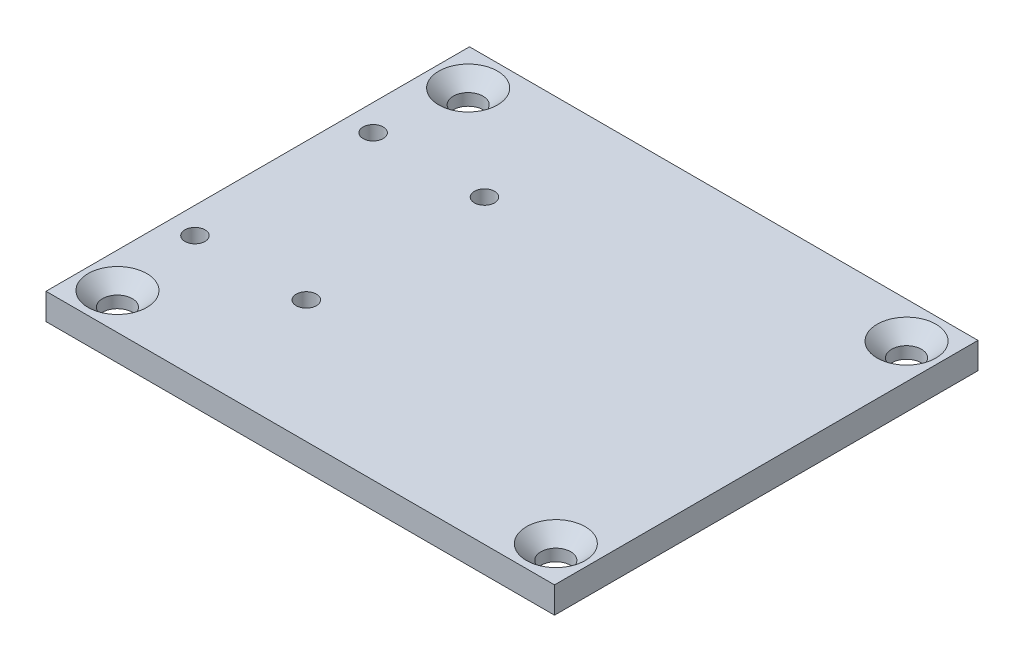
ISO-10303-21;
HEADER;
FILE_DESCRIPTION(('STEP AP214'),'2;1');
FILE_NAME('part.step','',(''),(''),'','','');
FILE_SCHEMA(('AUTOMOTIVE_DESIGN { 1 0 10303 214 1 1 1 1 }'));
ENDSEC;
DATA;
#1=APPLICATION_CONTEXT('core data for automotive mechanical design processes');
#2=APPLICATION_PROTOCOL_DEFINITION('international standard','automotive_design',2000,#1);
#3=PRODUCT_CONTEXT('',#1,'mechanical');
#4=PRODUCT('Part','Part','',(#3));
#5=PRODUCT_RELATED_PRODUCT_CATEGORY('part','',(#4));
#6=PRODUCT_DEFINITION_FORMATION('','',#4);
#7=PRODUCT_DEFINITION_CONTEXT('part definition',#1,'design');
#8=PRODUCT_DEFINITION('design','',#6,#7);
#9=PRODUCT_DEFINITION_SHAPE('','',#8);
#10=(LENGTH_UNIT() NAMED_UNIT(*) SI_UNIT(.MILLI.,.METRE.));
#11=(NAMED_UNIT(*) PLANE_ANGLE_UNIT() SI_UNIT($,.RADIAN.));
#12=(NAMED_UNIT(*) SI_UNIT($,.STERADIAN.) SOLID_ANGLE_UNIT());
#13=UNCERTAINTY_MEASURE_WITH_UNIT(LENGTH_MEASURE(1.E-05),#10,'distance_accuracy_value','');
#14=(GEOMETRIC_REPRESENTATION_CONTEXT(3) GLOBAL_UNCERTAINTY_ASSIGNED_CONTEXT((#13)) GLOBAL_UNIT_ASSIGNED_CONTEXT((#10,
#11,#12)) REPRESENTATION_CONTEXT('',''));
#15=CARTESIAN_POINT('',(0.,0.,0.));
#16=DIRECTION('',(0.,0.,1.));
#17=DIRECTION('',(1.,0.,0.));
#18=AXIS2_PLACEMENT_3D('',#15,#16,#17);
#19=CARTESIAN_POINT('',(-29.,3.,-24.15));
#20=DIRECTION('',(0.,0.,-1.));
#21=DIRECTION('',(-1.,0.,0.));
#22=AXIS2_PLACEMENT_3D('',#19,#20,#21);
#23=PLANE('',#22);
#24=DIRECTION('',(1.,0.,0.));
#25=VECTOR('',#24,1.);
#26=CARTESIAN_POINT('',(-29.,0.,-24.15));
#27=LINE('',#26,#25);
#28=CARTESIAN_POINT('',(-29.,0.,-24.15));
#29=VERTEX_POINT('',#28);
#30=CARTESIAN_POINT('',(29.,0.,-24.15));
#31=VERTEX_POINT('',#30);
#32=EDGE_CURVE('E119',#29,#31,#27,.T.);
#33=ORIENTED_EDGE('',*,*,#32,.F.);
#34=DIRECTION('',(0.,-1.,0.));
#35=VECTOR('',#34,1.);
#36=CARTESIAN_POINT('',(-29.,3.,-24.15));
#37=LINE('',#36,#35);
#38=CARTESIAN_POINT('',(-29.,3.,-24.15));
#39=VERTEX_POINT('',#38);
#40=EDGE_CURVE('E11',#39,#29,#37,.T.);
#41=ORIENTED_EDGE('',*,*,#40,.F.);
#42=DIRECTION('',(1.,0.,0.));
#43=VECTOR('',#42,1.);
#44=CARTESIAN_POINT('',(-29.,3.,-24.15));
#45=LINE('',#44,#43);
#46=CARTESIAN_POINT('',(29.,3.,-24.15));
#47=VERTEX_POINT('',#46);
#48=EDGE_CURVE('E112',#39,#47,#45,.T.);
#49=ORIENTED_EDGE('',*,*,#48,.T.);
#50=DIRECTION('',(0.,-1.,0.));
#51=VECTOR('',#50,1.);
#52=CARTESIAN_POINT('',(29.,3.,-24.15));
#53=LINE('',#52,#51);
#54=EDGE_CURVE('E110',#47,#31,#53,.T.);
#55=ORIENTED_EDGE('',*,*,#54,.T.);
#56=EDGE_LOOP('',(#33,#41,#49,#55));
#57=FACE_BOUND('',#56,.T.);
#58=ADVANCED_FACE('F50',(#57),#23,.T.);
#59=CARTESIAN_POINT('',(-29.,3.,24.15));
#60=DIRECTION('',(-1.,0.,0.));
#61=DIRECTION('',(0.,0.,1.));
#62=AXIS2_PLACEMENT_3D('',#59,#60,#61);
#63=PLANE('',#62);
#64=DIRECTION('',(0.,0.,-1.));
#65=VECTOR('',#64,1.);
#66=CARTESIAN_POINT('',(-29.,0.,24.15));
#67=LINE('',#66,#65);
#68=CARTESIAN_POINT('',(-29.,0.,24.15));
#69=VERTEX_POINT('',#68);
#70=EDGE_CURVE('E111',#69,#29,#67,.T.);
#71=ORIENTED_EDGE('',*,*,#70,.F.);
#72=DIRECTION('',(0.,-1.,0.));
#73=VECTOR('',#72,1.);
#74=CARTESIAN_POINT('',(-29.,3.,24.15));
#75=LINE('',#74,#73);
#76=CARTESIAN_POINT('',(-29.,3.,24.15));
#77=VERTEX_POINT('',#76);
#78=EDGE_CURVE('E60',#77,#69,#75,.T.);
#79=ORIENTED_EDGE('',*,*,#78,.F.);
#80=DIRECTION('',(0.,0.,-1.));
#81=VECTOR('',#80,1.);
#82=CARTESIAN_POINT('',(-29.,3.,24.15));
#83=LINE('',#82,#81);
#84=EDGE_CURVE('E96',#77,#39,#83,.T.);
#85=ORIENTED_EDGE('',*,*,#84,.T.);
#86=ORIENTED_EDGE('',*,*,#40,.T.);
#87=EDGE_LOOP('',(#71,#79,#85,#86));
#88=FACE_BOUND('',#87,.T.);
#89=ADVANCED_FACE('F233',(#88),#63,.T.);
#90=CARTESIAN_POINT('',(-29.,3.,24.15));
#91=DIRECTION('',(0.,0.,-1.));
#92=DIRECTION('',(-1.,0.,0.));
#93=AXIS2_PLACEMENT_3D('',#90,#91,#92);
#94=PLANE('',#93);
#95=DIRECTION('',(1.,0.,0.));
#96=VECTOR('',#95,1.);
#97=CARTESIAN_POINT('',(-29.,0.,24.15));
#98=LINE('',#97,#96);
#99=CARTESIAN_POINT('',(29.,0.,24.15));
#100=VERTEX_POINT('',#99);
#101=EDGE_CURVE('E105',#69,#100,#98,.T.);
#102=ORIENTED_EDGE('',*,*,#101,.T.);
#103=DIRECTION('',(0.,-1.,0.));
#104=VECTOR('',#103,1.);
#105=CARTESIAN_POINT('',(29.,3.,24.15));
#106=LINE('',#105,#104);
#107=CARTESIAN_POINT('',(29.,3.,24.15));
#108=VERTEX_POINT('',#107);
#109=EDGE_CURVE('E99',#108,#100,#106,.T.);
#110=ORIENTED_EDGE('',*,*,#109,.F.);
#111=DIRECTION('',(1.,0.,0.));
#112=VECTOR('',#111,1.);
#113=CARTESIAN_POINT('',(-29.,3.,24.15));
#114=LINE('',#113,#112);
#115=EDGE_CURVE('E91',#77,#108,#114,.T.);
#116=ORIENTED_EDGE('',*,*,#115,.F.);
#117=ORIENTED_EDGE('',*,*,#78,.T.);
#118=EDGE_LOOP('',(#102,#110,#116,#117));
#119=FACE_BOUND('',#118,.T.);
#120=ADVANCED_FACE('F101',(#119),#94,.F.);
#121=CARTESIAN_POINT('',(29.,3.,24.15));
#122=DIRECTION('',(-1.,0.,0.));
#123=DIRECTION('',(0.,0.,1.));
#124=AXIS2_PLACEMENT_3D('',#121,#122,#123);
#125=PLANE('',#124);
#126=DIRECTION('',(0.,0.,-1.));
#127=VECTOR('',#126,1.);
#128=CARTESIAN_POINT('',(29.,0.,24.15));
#129=LINE('',#128,#127);
#130=EDGE_CURVE('E123',#100,#31,#129,.T.);
#131=ORIENTED_EDGE('',*,*,#130,.T.);
#132=ORIENTED_EDGE('',*,*,#54,.F.);
#133=DIRECTION('',(0.,0.,-1.));
#134=VECTOR('',#133,1.);
#135=CARTESIAN_POINT('',(29.,3.,24.15));
#136=LINE('',#135,#134);
#137=EDGE_CURVE('E89',#108,#47,#136,.T.);
#138=ORIENTED_EDGE('',*,*,#137,.F.);
#139=ORIENTED_EDGE('',*,*,#109,.T.);
#140=EDGE_LOOP('',(#131,#132,#138,#139));
#141=FACE_BOUND('',#140,.T.);
#142=ADVANCED_FACE('F108',(#141),#125,.F.);
#143=CARTESIAN_POINT('',(0.,3.,0.));
#144=DIRECTION('',(0.,1.,0.));
#145=DIRECTION('',(0.,0.,1.));
#146=AXIS2_PLACEMENT_3D('',#143,#144,#145);
#147=PLANE('',#146);
#148=CARTESIAN_POINT('',(-25.9999999999998,3.,10.16));
#149=DIRECTION('',(0.,1.,0.));
#150=DIRECTION('',(0.,0.,1.));
#151=AXIS2_PLACEMENT_3D('',#148,#149,#150);
#152=CIRCLE('',#151,1.15);
#153=CARTESIAN_POINT('',(-25.9999999999998,3.,11.31));
#154=VERTEX_POINT('',#153);
#155=EDGE_CURVE('E357',#154,#154,#152,.T.);
#156=ORIENTED_EDGE('',*,*,#155,.F.);
#157=EDGE_LOOP('',(#156));
#158=FACE_BOUND('',#157,.T.);
#159=CARTESIAN_POINT('',(-13.2999999999998,3.,10.16));
#160=DIRECTION('',(0.,1.,0.));
#161=DIRECTION('',(0.,0.,1.));
#162=AXIS2_PLACEMENT_3D('',#159,#160,#161);
#163=CIRCLE('',#162,1.15);
#164=CARTESIAN_POINT('',(-13.2999999999998,3.,11.31));
#165=VERTEX_POINT('',#164);
#166=EDGE_CURVE('E362',#165,#165,#163,.T.);
#167=ORIENTED_EDGE('',*,*,#166,.F.);
#168=EDGE_LOOP('',(#167));
#169=FACE_BOUND('',#168,.T.);
#170=CARTESIAN_POINT('',(-13.3,3.,-10.16));
#171=DIRECTION('',(0.,1.,0.));
#172=DIRECTION('',(0.,0.,1.));
#173=AXIS2_PLACEMENT_3D('',#170,#171,#172);
#174=CIRCLE('',#173,1.15);
#175=CARTESIAN_POINT('',(-13.3,3.,-9.01));
#176=VERTEX_POINT('',#175);
#177=EDGE_CURVE('E364',#176,#176,#174,.T.);
#178=ORIENTED_EDGE('',*,*,#177,.F.);
#179=EDGE_LOOP('',(#178));
#180=FACE_BOUND('',#179,.T.);
#181=CARTESIAN_POINT('',(-26.,3.,-10.16));
#182=DIRECTION('',(0.,1.,0.));
#183=DIRECTION('',(0.,0.,1.));
#184=AXIS2_PLACEMENT_3D('',#181,#182,#183);
#185=CIRCLE('',#184,1.15);
#186=CARTESIAN_POINT('',(-26.,3.,-9.01));
#187=VERTEX_POINT('',#186);
#188=EDGE_CURVE('E142',#187,#187,#185,.T.);
#189=ORIENTED_EDGE('',*,*,#188,.F.);
#190=EDGE_LOOP('',(#189));
#191=FACE_BOUND('',#190,.T.);
#192=CARTESIAN_POINT('',(25.,3.,-20.));
#193=DIRECTION('',(0.,1.,0.));
#194=DIRECTION('',(0.,0.,1.));
#195=AXIS2_PLACEMENT_3D('',#192,#193,#194);
#196=CIRCLE('',#195,3.35);
#197=CARTESIAN_POINT('',(25.,3.,-16.65));
#198=VERTEX_POINT('',#197);
#199=EDGE_CURVE('E155',#198,#198,#196,.T.);
#200=ORIENTED_EDGE('',*,*,#199,.F.);
#201=EDGE_LOOP('',(#200));
#202=FACE_BOUND('',#201,.T.);
#203=CARTESIAN_POINT('',(-25.,3.,20.));
#204=DIRECTION('',(0.,1.,0.));
#205=DIRECTION('',(0.,0.,1.));
#206=AXIS2_PLACEMENT_3D('',#203,#204,#205);
#207=CIRCLE('',#206,3.35);
#208=CARTESIAN_POINT('',(-25.,3.,23.35));
#209=VERTEX_POINT('',#208);
#210=EDGE_CURVE('E171',#209,#209,#207,.T.);
#211=ORIENTED_EDGE('',*,*,#210,.F.);
#212=EDGE_LOOP('',(#211));
#213=FACE_BOUND('',#212,.T.);
#214=CARTESIAN_POINT('',(-25.,3.,-20.));
#215=DIRECTION('',(0.,1.,0.));
#216=DIRECTION('',(0.,0.,1.));
#217=AXIS2_PLACEMENT_3D('',#214,#215,#216);
#218=CIRCLE('',#217,3.35);
#219=CARTESIAN_POINT('',(-25.,3.,-16.65));
#220=VERTEX_POINT('',#219);
#221=EDGE_CURVE('E181',#220,#220,#218,.T.);
#222=ORIENTED_EDGE('',*,*,#221,.F.);
#223=EDGE_LOOP('',(#222));
#224=FACE_BOUND('',#223,.T.);
#225=CARTESIAN_POINT('',(25.,3.,20.));
#226=DIRECTION('',(0.,1.,0.));
#227=DIRECTION('',(0.,0.,1.));
#228=AXIS2_PLACEMENT_3D('',#225,#226,#227);
#229=CIRCLE('',#228,3.35);
#230=CARTESIAN_POINT('',(25.,3.,23.35));
#231=VERTEX_POINT('',#230);
#232=EDGE_CURVE('E192',#231,#231,#229,.T.);
#233=ORIENTED_EDGE('',*,*,#232,.F.);
#234=EDGE_LOOP('',(#233));
#235=FACE_BOUND('',#234,.T.);
#236=ORIENTED_EDGE('',*,*,#48,.F.);
#237=ORIENTED_EDGE('',*,*,#84,.F.);
#238=ORIENTED_EDGE('',*,*,#115,.T.);
#239=ORIENTED_EDGE('',*,*,#137,.T.);
#240=EDGE_LOOP('',(#236,#237,#238,#239));
#241=FACE_BOUND('',#240,.T.);
#242=ADVANCED_FACE('F92',(#158,#169,#180,#191,#202,#213,#224,#235,#241),#147,.T.);
#243=CARTESIAN_POINT('',(0.,0.,0.));
#244=DIRECTION('',(0.,1.,0.));
#245=DIRECTION('',(0.,0.,1.));
#246=AXIS2_PLACEMENT_3D('',#243,#244,#245);
#247=PLANE('',#246);
#248=CARTESIAN_POINT('',(-25.9999999999998,0.,10.16));
#249=DIRECTION('',(0.,1.,0.));
#250=DIRECTION('',(0.,0.,1.));
#251=AXIS2_PLACEMENT_3D('',#248,#249,#250);
#252=CIRCLE('',#251,1.15);
#253=CARTESIAN_POINT('',(-25.9999999999998,0.,11.31));
#254=VERTEX_POINT('',#253);
#255=EDGE_CURVE('E49',#254,#254,#252,.T.);
#256=ORIENTED_EDGE('',*,*,#255,.T.);
#257=EDGE_LOOP('',(#256));
#258=FACE_BOUND('',#257,.T.);
#259=CARTESIAN_POINT('',(-13.2999999999998,0.,10.16));
#260=DIRECTION('',(0.,1.,0.));
#261=DIRECTION('',(0.,0.,1.));
#262=AXIS2_PLACEMENT_3D('',#259,#260,#261);
#263=CIRCLE('',#262,1.15);
#264=CARTESIAN_POINT('',(-13.2999999999998,0.,11.31));
#265=VERTEX_POINT('',#264);
#266=EDGE_CURVE('E144',#265,#265,#263,.T.);
#267=ORIENTED_EDGE('',*,*,#266,.T.);
#268=EDGE_LOOP('',(#267));
#269=FACE_BOUND('',#268,.T.);
#270=CARTESIAN_POINT('',(-13.3,0.,-10.16));
#271=DIRECTION('',(0.,1.,0.));
#272=DIRECTION('',(0.,0.,1.));
#273=AXIS2_PLACEMENT_3D('',#270,#271,#272);
#274=CIRCLE('',#273,1.15);
#275=CARTESIAN_POINT('',(-13.3,0.,-9.01));
#276=VERTEX_POINT('',#275);
#277=EDGE_CURVE('E143',#276,#276,#274,.T.);
#278=ORIENTED_EDGE('',*,*,#277,.T.);
#279=EDGE_LOOP('',(#278));
#280=FACE_BOUND('',#279,.T.);
#281=CARTESIAN_POINT('',(-26.,0.,-10.16));
#282=DIRECTION('',(0.,1.,0.));
#283=DIRECTION('',(0.,0.,1.));
#284=AXIS2_PLACEMENT_3D('',#281,#282,#283);
#285=CIRCLE('',#284,1.15);
#286=CARTESIAN_POINT('',(-26.,0.,-9.01));
#287=VERTEX_POINT('',#286);
#288=EDGE_CURVE('E136',#287,#287,#285,.T.);
#289=ORIENTED_EDGE('',*,*,#288,.T.);
#290=EDGE_LOOP('',(#289));
#291=FACE_BOUND('',#290,.T.);
#292=CARTESIAN_POINT('',(25.,0.,-20.));
#293=DIRECTION('',(0.,1.,0.));
#294=DIRECTION('',(0.,0.,1.));
#295=AXIS2_PLACEMENT_3D('',#292,#293,#294);
#296=CIRCLE('',#295,1.7);
#297=CARTESIAN_POINT('',(25.,0.,-18.3));
#298=VERTEX_POINT('',#297);
#299=EDGE_CURVE('E162',#298,#298,#296,.T.);
#300=ORIENTED_EDGE('',*,*,#299,.T.);
#301=EDGE_LOOP('',(#300));
#302=FACE_BOUND('',#301,.T.);
#303=CARTESIAN_POINT('',(-25.,0.,20.));
#304=DIRECTION('',(0.,1.,0.));
#305=DIRECTION('',(0.,0.,1.));
#306=AXIS2_PLACEMENT_3D('',#303,#304,#305);
#307=CIRCLE('',#306,1.7);
#308=CARTESIAN_POINT('',(-25.,0.,21.7));
#309=VERTEX_POINT('',#308);
#310=EDGE_CURVE('E178',#309,#309,#307,.T.);
#311=ORIENTED_EDGE('',*,*,#310,.T.);
#312=EDGE_LOOP('',(#311));
#313=FACE_BOUND('',#312,.T.);
#314=CARTESIAN_POINT('',(-25.,0.,-20.));
#315=DIRECTION('',(0.,1.,0.));
#316=DIRECTION('',(0.,0.,1.));
#317=AXIS2_PLACEMENT_3D('',#314,#315,#316);
#318=CIRCLE('',#317,1.7);
#319=CARTESIAN_POINT('',(-25.,0.,-18.3));
#320=VERTEX_POINT('',#319);
#321=EDGE_CURVE('E194',#320,#320,#318,.T.);
#322=ORIENTED_EDGE('',*,*,#321,.T.);
#323=EDGE_LOOP('',(#322));
#324=FACE_BOUND('',#323,.T.);
#325=CARTESIAN_POINT('',(25.,0.,20.));
#326=DIRECTION('',(0.,1.,0.));
#327=DIRECTION('',(0.,0.,1.));
#328=AXIS2_PLACEMENT_3D('',#325,#326,#327);
#329=CIRCLE('',#328,1.7);
#330=CARTESIAN_POINT('',(25.,0.,21.7));
#331=VERTEX_POINT('',#330);
#332=EDGE_CURVE('E122',#331,#331,#329,.T.);
#333=ORIENTED_EDGE('',*,*,#332,.T.);
#334=EDGE_LOOP('',(#333));
#335=FACE_BOUND('',#334,.T.);
#336=ORIENTED_EDGE('',*,*,#32,.T.);
#337=ORIENTED_EDGE('',*,*,#130,.F.);
#338=ORIENTED_EDGE('',*,*,#101,.F.);
#339=ORIENTED_EDGE('',*,*,#70,.T.);
#340=EDGE_LOOP('',(#336,#337,#338,#339));
#341=FACE_BOUND('',#340,.T.);
#342=ADVANCED_FACE('F206',(#258,#269,#280,#291,#302,#313,#324,#335,#341),#247,.F.);
#343=CARTESIAN_POINT('',(25.,3.,20.));
#344=DIRECTION('',(0.,1.,0.));
#345=DIRECTION('',(0.,0.,1.));
#346=AXIS2_PLACEMENT_3D('',#343,#344,#345);
#347=CYLINDRICAL_SURFACE('',#346,1.7);
#348=ORIENTED_EDGE('',*,*,#332,.F.);
#349=EDGE_LOOP('',(#348));
#350=FACE_BOUND('',#349,.T.);
#351=CARTESIAN_POINT('',(25.,1.35,20.));
#352=DIRECTION('',(0.,1.,0.));
#353=DIRECTION('',(0.,0.,1.));
#354=AXIS2_PLACEMENT_3D('',#351,#352,#353);
#355=CIRCLE('',#354,1.7);
#356=CARTESIAN_POINT('',(25.,1.35,21.7));
#357=VERTEX_POINT('',#356);
#358=EDGE_CURVE('E200',#357,#357,#355,.T.);
#359=ORIENTED_EDGE('',*,*,#358,.T.);
#360=EDGE_LOOP('',(#359));
#361=FACE_BOUND('',#360,.T.);
#362=ADVANCED_FACE('F207',(#350,#361),#347,.F.);
#363=CARTESIAN_POINT('',(25.,3.,20.));
#364=DIRECTION('',(0.,1.,0.));
#365=DIRECTION('',(0.,0.,1.));
#366=AXIS2_PLACEMENT_3D('',#363,#364,#365);
#367=CONICAL_SURFACE('',#366,3.35,0.785398163397448);
#368=ORIENTED_EDGE('',*,*,#358,.F.);
#369=EDGE_LOOP('',(#368));
#370=FACE_BOUND('',#369,.T.);
#371=ORIENTED_EDGE('',*,*,#232,.T.);
#372=EDGE_LOOP('',(#371));
#373=FACE_BOUND('',#372,.T.);
#374=ADVANCED_FACE('F215',(#370,#373),#367,.F.);
#375=CARTESIAN_POINT('',(-25.,3.,-20.));
#376=DIRECTION('',(0.,1.,0.));
#377=DIRECTION('',(0.,0.,1.));
#378=AXIS2_PLACEMENT_3D('',#375,#376,#377);
#379=CYLINDRICAL_SURFACE('',#378,1.7);
#380=ORIENTED_EDGE('',*,*,#321,.F.);
#381=EDGE_LOOP('',(#380));
#382=FACE_BOUND('',#381,.T.);
#383=CARTESIAN_POINT('',(-25.,1.35,-20.));
#384=DIRECTION('',(0.,1.,0.));
#385=DIRECTION('',(0.,0.,1.));
#386=AXIS2_PLACEMENT_3D('',#383,#384,#385);
#387=CIRCLE('',#386,1.7);
#388=CARTESIAN_POINT('',(-25.,1.35,-18.3));
#389=VERTEX_POINT('',#388);
#390=EDGE_CURVE('E190',#389,#389,#387,.T.);
#391=ORIENTED_EDGE('',*,*,#390,.T.);
#392=EDGE_LOOP('',(#391));
#393=FACE_BOUND('',#392,.T.);
#394=ADVANCED_FACE('F217',(#382,#393),#379,.F.);
#395=CARTESIAN_POINT('',(-25.,3.,-20.));
#396=DIRECTION('',(0.,1.,0.));
#397=DIRECTION('',(0.,0.,1.));
#398=AXIS2_PLACEMENT_3D('',#395,#396,#397);
#399=CONICAL_SURFACE('',#398,3.35,0.785398163397448);
#400=ORIENTED_EDGE('',*,*,#390,.F.);
#401=EDGE_LOOP('',(#400));
#402=FACE_BOUND('',#401,.T.);
#403=ORIENTED_EDGE('',*,*,#221,.T.);
#404=EDGE_LOOP('',(#403));
#405=FACE_BOUND('',#404,.T.);
#406=ADVANCED_FACE('F267',(#402,#405),#399,.F.);
#407=CARTESIAN_POINT('',(-25.,3.,20.));
#408=DIRECTION('',(0.,1.,0.));
#409=DIRECTION('',(0.,0.,1.));
#410=AXIS2_PLACEMENT_3D('',#407,#408,#409);
#411=CYLINDRICAL_SURFACE('',#410,1.7);
#412=ORIENTED_EDGE('',*,*,#310,.F.);
#413=EDGE_LOOP('',(#412));
#414=FACE_BOUND('',#413,.T.);
#415=CARTESIAN_POINT('',(-25.,1.35,20.));
#416=DIRECTION('',(0.,1.,0.));
#417=DIRECTION('',(0.,0.,1.));
#418=AXIS2_PLACEMENT_3D('',#415,#416,#417);
#419=CIRCLE('',#418,1.7);
#420=CARTESIAN_POINT('',(-25.,1.35,21.7));
#421=VERTEX_POINT('',#420);
#422=EDGE_CURVE('E174',#421,#421,#419,.T.);
#423=ORIENTED_EDGE('',*,*,#422,.T.);
#424=EDGE_LOOP('',(#423));
#425=FACE_BOUND('',#424,.T.);
#426=ADVANCED_FACE('F279',(#414,#425),#411,.F.);
#427=CARTESIAN_POINT('',(-25.,3.,20.));
#428=DIRECTION('',(0.,1.,0.));
#429=DIRECTION('',(0.,0.,1.));
#430=AXIS2_PLACEMENT_3D('',#427,#428,#429);
#431=CONICAL_SURFACE('',#430,3.35,0.785398163397448);
#432=ORIENTED_EDGE('',*,*,#422,.F.);
#433=EDGE_LOOP('',(#432));
#434=FACE_BOUND('',#433,.T.);
#435=ORIENTED_EDGE('',*,*,#210,.T.);
#436=EDGE_LOOP('',(#435));
#437=FACE_BOUND('',#436,.T.);
#438=ADVANCED_FACE('F286',(#434,#437),#431,.F.);
#439=CARTESIAN_POINT('',(25.,3.,-20.));
#440=DIRECTION('',(0.,1.,0.));
#441=DIRECTION('',(0.,0.,1.));
#442=AXIS2_PLACEMENT_3D('',#439,#440,#441);
#443=CYLINDRICAL_SURFACE('',#442,1.7);
#444=ORIENTED_EDGE('',*,*,#299,.F.);
#445=EDGE_LOOP('',(#444));
#446=FACE_BOUND('',#445,.T.);
#447=CARTESIAN_POINT('',(25.,1.35,-20.));
#448=DIRECTION('',(0.,1.,0.));
#449=DIRECTION('',(0.,0.,1.));
#450=AXIS2_PLACEMENT_3D('',#447,#448,#449);
#451=CIRCLE('',#450,1.7);
#452=CARTESIAN_POINT('',(25.,1.35,-18.3));
#453=VERTEX_POINT('',#452);
#454=EDGE_CURVE('E160',#453,#453,#451,.T.);
#455=ORIENTED_EDGE('',*,*,#454,.T.);
#456=EDGE_LOOP('',(#455));
#457=FACE_BOUND('',#456,.T.);
#458=ADVANCED_FACE('F296',(#446,#457),#443,.F.);
#459=CARTESIAN_POINT('',(25.,3.,-20.));
#460=DIRECTION('',(0.,1.,0.));
#461=DIRECTION('',(0.,0.,1.));
#462=AXIS2_PLACEMENT_3D('',#459,#460,#461);
#463=CONICAL_SURFACE('',#462,3.35,0.785398163397448);
#464=ORIENTED_EDGE('',*,*,#454,.F.);
#465=EDGE_LOOP('',(#464));
#466=FACE_BOUND('',#465,.T.);
#467=ORIENTED_EDGE('',*,*,#199,.T.);
#468=EDGE_LOOP('',(#467));
#469=FACE_BOUND('',#468,.T.);
#470=ADVANCED_FACE('F303',(#466,#469),#463,.F.);
#471=CARTESIAN_POINT('',(-26.,-7.,-10.16));
#472=DIRECTION('',(0.,1.,0.));
#473=DIRECTION('',(0.,0.,1.));
#474=AXIS2_PLACEMENT_3D('',#471,#472,#473);
#475=CYLINDRICAL_SURFACE('',#474,1.15);
#476=ORIENTED_EDGE('',*,*,#188,.T.);
#477=EDGE_LOOP('',(#476));
#478=FACE_BOUND('',#477,.T.);
#479=ORIENTED_EDGE('',*,*,#288,.F.);
#480=EDGE_LOOP('',(#479));
#481=FACE_BOUND('',#480,.T.);
#482=ADVANCED_FACE('F315',(#478,#481),#475,.F.);
#483=CARTESIAN_POINT('',(-13.3,-7.,-10.16));
#484=DIRECTION('',(0.,1.,0.));
#485=DIRECTION('',(0.,0.,1.));
#486=AXIS2_PLACEMENT_3D('',#483,#484,#485);
#487=CYLINDRICAL_SURFACE('',#486,1.15);
#488=ORIENTED_EDGE('',*,*,#177,.T.);
#489=EDGE_LOOP('',(#488));
#490=FACE_BOUND('',#489,.T.);
#491=ORIENTED_EDGE('',*,*,#277,.F.);
#492=EDGE_LOOP('',(#491));
#493=FACE_BOUND('',#492,.T.);
#494=ADVANCED_FACE('F324',(#490,#493),#487,.F.);
#495=CARTESIAN_POINT('',(-13.2999999999998,-7.,10.16));
#496=DIRECTION('',(0.,1.,0.));
#497=DIRECTION('',(0.,0.,1.));
#498=AXIS2_PLACEMENT_3D('',#495,#496,#497);
#499=CYLINDRICAL_SURFACE('',#498,1.15);
#500=ORIENTED_EDGE('',*,*,#166,.T.);
#501=EDGE_LOOP('',(#500));
#502=FACE_BOUND('',#501,.T.);
#503=ORIENTED_EDGE('',*,*,#266,.F.);
#504=EDGE_LOOP('',(#503));
#505=FACE_BOUND('',#504,.T.);
#506=ADVANCED_FACE('F333',(#502,#505),#499,.F.);
#507=CARTESIAN_POINT('',(-25.9999999999998,-7.,10.16));
#508=DIRECTION('',(0.,1.,0.));
#509=DIRECTION('',(0.,0.,1.));
#510=AXIS2_PLACEMENT_3D('',#507,#508,#509);
#511=CYLINDRICAL_SURFACE('',#510,1.15);
#512=ORIENTED_EDGE('',*,*,#155,.T.);
#513=EDGE_LOOP('',(#512));
#514=FACE_BOUND('',#513,.T.);
#515=ORIENTED_EDGE('',*,*,#255,.F.);
#516=EDGE_LOOP('',(#515));
#517=FACE_BOUND('',#516,.T.);
#518=ADVANCED_FACE('F342',(#514,#517),#511,.F.);
#519=CLOSED_SHELL('',(#58,#89,#120,#142,#242,#342,#362,#374,#394,#406,#426,#438,#458,#470,#482,
#494,#506,#518));
#520=MANIFOLD_SOLID_BREP('B2',#519);
#521=ADVANCED_BREP_SHAPE_REPRESENTATION('',(#18,#520),#14);
#522=SHAPE_DEFINITION_REPRESENTATION(#9,#521);
ENDSEC;
END-ISO-10303-21;
